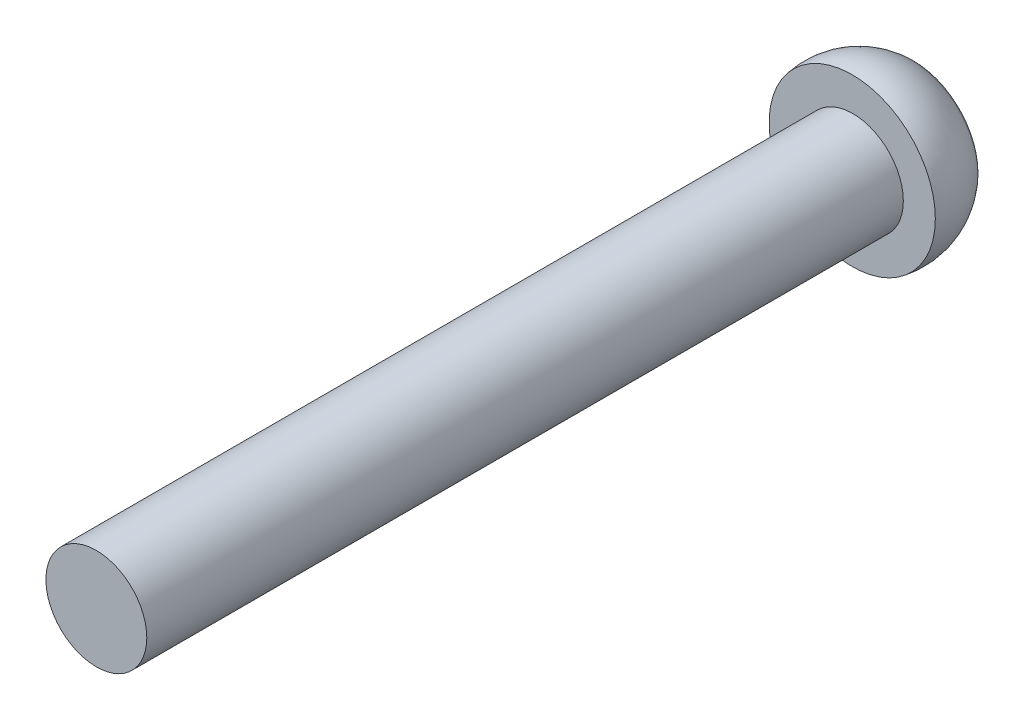
ISO-10303-21;
HEADER;
FILE_DESCRIPTION(('STEP AP214'),'2;1');
FILE_NAME('part.step','',(''),(''),'','','');
FILE_SCHEMA(('AUTOMOTIVE_DESIGN { 1 0 10303 214 1 1 1 1 }'));
ENDSEC;
DATA;
#1=APPLICATION_CONTEXT('core data for automotive mechanical design processes');
#2=APPLICATION_PROTOCOL_DEFINITION('international standard','automotive_design',2000,#1);
#3=PRODUCT_CONTEXT('',#1,'mechanical');
#4=PRODUCT('Part','Part','',(#3));
#5=PRODUCT_RELATED_PRODUCT_CATEGORY('part','',(#4));
#6=PRODUCT_DEFINITION_FORMATION('','',#4);
#7=PRODUCT_DEFINITION_CONTEXT('part definition',#1,'design');
#8=PRODUCT_DEFINITION('design','',#6,#7);
#9=PRODUCT_DEFINITION_SHAPE('','',#8);
#10=(LENGTH_UNIT() NAMED_UNIT(*) SI_UNIT(.MILLI.,.METRE.));
#11=(NAMED_UNIT(*) PLANE_ANGLE_UNIT() SI_UNIT($,.RADIAN.));
#12=(NAMED_UNIT(*) SI_UNIT($,.STERADIAN.) SOLID_ANGLE_UNIT());
#13=UNCERTAINTY_MEASURE_WITH_UNIT(LENGTH_MEASURE(1.E-05),#10,'distance_accuracy_value','');
#14=(GEOMETRIC_REPRESENTATION_CONTEXT(3) GLOBAL_UNCERTAINTY_ASSIGNED_CONTEXT((#13)) GLOBAL_UNIT_ASSIGNED_CONTEXT((#10,
#11,#12)) REPRESENTATION_CONTEXT('',''));
#15=CARTESIAN_POINT('',(0.,0.,0.));
#16=DIRECTION('',(0.,0.,1.));
#17=DIRECTION('',(1.,0.,0.));
#18=AXIS2_PLACEMENT_3D('',#15,#16,#17);
#19=CARTESIAN_POINT('',(0.,0.,0.));
#20=DIRECTION('',(0.,0.,1.));
#21=DIRECTION('',(1.,0.,0.));
#22=AXIS2_PLACEMENT_3D('',#19,#20,#21);
#23=PLANE('',#22);
#24=CARTESIAN_POINT('',(0.,0.,0.));
#25=DIRECTION('',(0.,0.,1.));
#26=DIRECTION('',(1.,0.,0.));
#27=AXIS2_PLACEMENT_3D('',#24,#25,#26);
#28=CIRCLE('',#27,1.64786324972712);
#29=CARTESIAN_POINT('',(1.64786324972712,0.,0.));
#30=VERTEX_POINT('',#29);
#31=EDGE_CURVE('E204',#30,#30,#28,.T.);
#32=ORIENTED_EDGE('',*,*,#31,.T.);
#33=EDGE_LOOP('',(#32));
#34=FACE_BOUND('',#33,.T.);
#35=CARTESIAN_POINT('',(0.0135896024399493,-0.0135896024399496,0.));
#36=DIRECTION('',(0.,0.,1.));
#37=DIRECTION('',(1.,0.,0.));
#38=AXIS2_PLACEMENT_3D('',#35,#36,#37);
#39=CIRCLE('',#38,1.);
#40=CARTESIAN_POINT('',(1.01358960243995,-0.0135896024399496,0.));
#41=VERTEX_POINT('',#40);
#42=EDGE_CURVE('E344',#41,#41,#39,.T.);
#43=ORIENTED_EDGE('',*,*,#42,.F.);
#44=EDGE_LOOP('',(#43));
#45=FACE_BOUND('',#44,.T.);
#46=ADVANCED_FACE('F35',(#34,#45),#23,.T.);
#47=CARTESIAN_POINT('',(0.,0.,-1.34074998965091));
#48=DIRECTION('',(0.,0.,-1.));
#49=DIRECTION('',(-1.,0.,0.));
#50=AXIS2_PLACEMENT_3D('',#47,#48,#49);
#51=PLANE('',#50);
#52=DIRECTION('',(0.,-1.,0.));
#53=VECTOR('',#52,1.);
#54=CARTESIAN_POINT('',(0.25,-0.25,-1.34074998965091));
#55=LINE('',#54,#53);
#56=CARTESIAN_POINT('',(0.25,-0.25,-1.34074998965091));
#57=VERTEX_POINT('',#56);
#58=CARTESIAN_POINT('',(0.25,-0.912522745887616,-1.34074998965091));
#59=VERTEX_POINT('',#58);
#60=EDGE_CURVE('E323',#57,#59,#55,.T.);
#61=ORIENTED_EDGE('',*,*,#60,.F.);
#62=DIRECTION('',(-1.,0.,0.));
#63=VECTOR('',#62,1.);
#64=CARTESIAN_POINT('',(1.,-0.25,-1.34074998965091));
#65=LINE('',#64,#63);
#66=CARTESIAN_POINT('',(0.912522745887616,-0.25,-1.34074998965091));
#67=VERTEX_POINT('',#66);
#68=EDGE_CURVE('E357',#67,#57,#65,.T.);
#69=ORIENTED_EDGE('',*,*,#68,.F.);
#70=CARTESIAN_POINT('',(0.,0.,-1.34074998965091));
#71=DIRECTION('',(0.,0.,1.));
#72=DIRECTION('',(1.,0.,0.));
#73=AXIS2_PLACEMENT_3D('',#70,#71,#72);
#74=CIRCLE('',#73,0.946148910987205);
#75=EDGE_CURVE('E210',#59,#67,#74,.T.);
#76=ORIENTED_EDGE('',*,*,#75,.F.);
#77=EDGE_LOOP('',(#61,#69,#76));
#78=FACE_BOUND('',#77,.T.);
#79=ADVANCED_FACE('F384',(#78),#51,.T.);
#80=DIRECTION('',(1.,0.,0.));
#81=VECTOR('',#80,1.);
#82=CARTESIAN_POINT('',(1.,0.25,-1.34074998965091));
#83=LINE('',#82,#81);
#84=CARTESIAN_POINT('',(0.25,0.25,-1.34074998965091));
#85=VERTEX_POINT('',#84);
#86=CARTESIAN_POINT('',(0.912522745887616,0.25,-1.34074998965091));
#87=VERTEX_POINT('',#86);
#88=EDGE_CURVE('E355',#85,#87,#83,.T.);
#89=ORIENTED_EDGE('',*,*,#88,.F.);
#90=DIRECTION('',(0.,-1.,0.));
#91=VECTOR('',#90,1.);
#92=CARTESIAN_POINT('',(0.25,1.,-1.34074998965091));
#93=LINE('',#92,#91);
#94=CARTESIAN_POINT('',(0.25,0.912522745887616,-1.34074998965091));
#95=VERTEX_POINT('',#94);
#96=EDGE_CURVE('E352',#95,#85,#93,.T.);
#97=ORIENTED_EDGE('',*,*,#96,.F.);
#98=EDGE_CURVE('E211',#87,#95,#74,.T.);
#99=ORIENTED_EDGE('',*,*,#98,.F.);
#100=EDGE_LOOP('',(#89,#97,#99));
#101=FACE_BOUND('',#100,.T.);
#102=ADVANCED_FACE('F405',(#101),#51,.T.);
#103=DIRECTION('',(0.,1.,0.));
#104=VECTOR('',#103,1.);
#105=CARTESIAN_POINT('',(-0.25,1.,-1.34074998965091));
#106=LINE('',#105,#104);
#107=CARTESIAN_POINT('',(-0.25,0.25,-1.34074998965091));
#108=VERTEX_POINT('',#107);
#109=CARTESIAN_POINT('',(-0.25,0.912522745887616,-1.34074998965091));
#110=VERTEX_POINT('',#109);
#111=EDGE_CURVE('E350',#108,#110,#106,.T.);
#112=ORIENTED_EDGE('',*,*,#111,.F.);
#113=DIRECTION('',(1.,0.,0.));
#114=VECTOR('',#113,1.);
#115=CARTESIAN_POINT('',(-0.25,0.25,-1.34074998965091));
#116=LINE('',#115,#114);
#117=CARTESIAN_POINT('',(-0.912522745887616,0.25,-1.34074998965091));
#118=VERTEX_POINT('',#117);
#119=EDGE_CURVE('E341',#118,#108,#116,.T.);
#120=ORIENTED_EDGE('',*,*,#119,.F.);
#121=EDGE_CURVE('E214',#110,#118,#74,.T.);
#122=ORIENTED_EDGE('',*,*,#121,.F.);
#123=EDGE_LOOP('',(#112,#120,#122));
#124=FACE_BOUND('',#123,.T.);
#125=ADVANCED_FACE('F393',(#124),#51,.T.);
#126=DIRECTION('',(0.,1.,0.));
#127=VECTOR('',#126,1.);
#128=CARTESIAN_POINT('',(-0.25,-0.25,-1.34074998965091));
#129=LINE('',#128,#127);
#130=CARTESIAN_POINT('',(-0.25,-0.912522745887616,-1.34074998965091));
#131=VERTEX_POINT('',#130);
#132=CARTESIAN_POINT('',(-0.25,-0.25,-1.34074998965091));
#133=VERTEX_POINT('',#132);
#134=EDGE_CURVE('E336',#131,#133,#129,.T.);
#135=ORIENTED_EDGE('',*,*,#134,.F.);
#136=CARTESIAN_POINT('',(-0.912522745887616,-0.25,-1.34074998965091));
#137=VERTEX_POINT('',#136);
#138=EDGE_CURVE('E332',#137,#131,#74,.T.);
#139=ORIENTED_EDGE('',*,*,#138,.F.);
#140=DIRECTION('',(-1.,0.,0.));
#141=VECTOR('',#140,1.);
#142=CARTESIAN_POINT('',(-0.25,-0.25,-1.34074998965091));
#143=LINE('',#142,#141);
#144=EDGE_CURVE('E54',#133,#137,#143,.T.);
#145=ORIENTED_EDGE('',*,*,#144,.F.);
#146=EDGE_LOOP('',(#135,#139,#145));
#147=FACE_BOUND('',#146,.T.);
#148=ADVANCED_FACE('F338',(#147),#51,.T.);
#149=CARTESIAN_POINT('',(0.,0.,-0.840749989650906));
#150=DIRECTION('',(0.,0.,1.));
#151=DIRECTION('',(1.,0.,0.));
#152=AXIS2_PLACEMENT_3D('',#149,#150,#151);
#153=TOROIDAL_SURFACE('',#152,0.946148910987205,0.5);
#154=CARTESIAN_POINT('',(-0.248731418139729,-1.00019999999798,-1.33355550441005));
#155=CARTESIAN_POINT('',(-0.24958614674247,-0.970985632246849,-1.33840291119549));
#156=CARTESIAN_POINT('',(-0.250008527124177,-0.941356796484875,-1.34079834937522));
#157=CARTESIAN_POINT('',(-0.249991262751628,-0.882089876302517,-1.34070043825306));
#158=CARTESIAN_POINT('',(-0.249551119047547,-0.85245179645112,-1.33820425926608));
#159=CARTESIAN_POINT('',(-0.247809665705305,-0.793993999996859,-1.32832798658651));
#160=CARTESIAN_POINT('',(-0.246507536336563,-0.765175089641474,-1.32094324397078));
#161=CARTESIAN_POINT('',(-0.243070557403056,-0.709267037425154,-1.30145116783077));
#162=CARTESIAN_POINT('',(-0.240936699840295,-0.682175879498399,-1.28934946022943));
#163=CARTESIAN_POINT('',(-0.235964122234399,-0.63141444611803,-1.26114857125648));
#164=CARTESIAN_POINT('',(-0.233151434951457,-0.607659926555948,-1.24519702900446));
#165=CARTESIAN_POINT('',(-0.226841694587375,-0.563251924748829,-1.20941271319113));
#166=CARTESIAN_POINT('',(-0.223342242870993,-0.542609773111442,-1.18956633629338));
#167=CARTESIAN_POINT('',(-0.219536364668565,-0.523969633910927,-1.16798212843628));
#168=B_SPLINE_CURVE_WITH_KNOTS('',3,(#154,#155,#156,#157,#158,#159,#160,#161,#162,#163,#164,
#165,#166,#167),.UNSPECIFIED.,.F.,.F.,(4,2,2,2,2,2,4),(0.,0.0887691650607502,0.177589696147095,
0.266494815301146,0.355294220222159,0.441116211611775,0.527243463159091),.UNSPECIFIED.);
#169=CARTESIAN_POINT('',(-0.248772653500362,-0.998772653500362,-1.33378936176114));
#170=VERTEX_POINT('',#169);
#171=EDGE_CURVE('E11',#170,#131,#168,.T.);
#172=ORIENTED_EDGE('',*,*,#171,.F.);
#173=CARTESIAN_POINT('',(0.2502,-0.998762636472414,-1.33373255237265));
#174=CARTESIAN_POINT('',(0.22935821029771,-0.998909155419599,-1.33456350261405));
#175=CARTESIAN_POINT('',(0.208510714237745,-0.99902632673639,-1.33522801417274));
#176=CARTESIAN_POINT('',(0.166810073600685,-0.999214972415781,-1.33629787698463));
#177=CARTESIAN_POINT('',(0.145956929482305,-0.999286449767193,-1.3367032451882));
#178=CARTESIAN_POINT('',(0.0834051338906349,-0.999451826949895,-1.33764114579784));
#179=CARTESIAN_POINT('',(0.0417025669453174,-0.999496738672754,-1.33789585283518));
#180=CARTESIAN_POINT('',(-0.0417025669453178,-0.999496738672754,-1.33789585283518));
#181=CARTESIAN_POINT('',(-0.0834051338906354,-0.999451826949895,-1.33764114579784));
#182=CARTESIAN_POINT('',(-0.145956929482306,-0.999286449767193,-1.3367032451882));
#183=CARTESIAN_POINT('',(-0.166810073600686,-0.999214972415781,-1.33629787698463));
#184=CARTESIAN_POINT('',(-0.208510714237745,-0.99902632673639,-1.33522801417274));
#185=CARTESIAN_POINT('',(-0.22935821029771,-0.998909155419599,-1.33456350261405));
#186=CARTESIAN_POINT('',(-0.2502,-0.998762636472414,-1.33373255237265));
#187=B_SPLINE_CURVE_WITH_KNOTS('',3,(#173,#174,#175,#176,#177,#178,#179,#180,#181,#182,#183,
#184,#185,#186),.UNSPECIFIED.,.F.,.F.,(4,2,2,2,2,2,4),(0.,0.0625742628865592,0.125144432413641,
0.250250102299897,0.375355772186154,0.437925941713235,0.500500204599794),.UNSPECIFIED.);
#188=CARTESIAN_POINT('',(0.248772653499892,-0.998772653499892,-1.33378936175847));
#189=VERTEX_POINT('',#188);
#190=EDGE_CURVE('E47',#189,#170,#187,.T.);
#191=ORIENTED_EDGE('',*,*,#190,.F.);
#192=CARTESIAN_POINT('',(0.219536364668565,-0.523969633910927,-1.16798212843628));
#193=CARTESIAN_POINT('',(0.223417162959779,-0.542973823364192,-1.18999122923084));
#194=CARTESIAN_POINT('',(0.22697935323117,-0.564063715021397,-1.210193414155));
#195=CARTESIAN_POINT('',(0.23338358711039,-0.609458557906342,-1.2465136293228));
#196=CARTESIAN_POINT('',(0.236228669439464,-0.633749255233126,-1.262648893011));
#197=CARTESIAN_POINT('',(0.241004749968007,-0.683258284015449,-1.28973539168155));
#198=CARTESIAN_POINT('',(0.24297988223307,-0.708336626868522,-1.30093692338774));
#199=CARTESIAN_POINT('',(0.246219254039212,-0.76000121173847,-1.3193083138189));
#200=CARTESIAN_POINT('',(0.247482662017373,-0.78658917782316,-1.3264734565162));
#201=CARTESIAN_POINT('',(0.249394296316473,-0.844287328167994,-1.33731487336245));
#202=CARTESIAN_POINT('',(0.249934375709412,-0.875517583212375,-1.34037781580477));
#203=CARTESIAN_POINT('',(0.250054829507455,-0.938055105897448,-1.34106094323972));
#204=CARTESIAN_POINT('',(0.249634703786009,-0.969362405183311,-1.33867829187373));
#205=CARTESIAN_POINT('',(0.248731418139729,-1.00019999999798,-1.33355550441005));
#206=B_SPLINE_CURVE_WITH_KNOTS('',3,(#192,#193,#194,#195,#196,#197,#198,#199,#200,#201,#202,
#203,#204,#205),.UNSPECIFIED.,.F.,.F.,(4,2,2,2,2,2,4),(0.,0.0878170982428003,0.175255569681402,
0.257519005261126,0.339878357327818,0.43353414273552,0.527238720237572),.UNSPECIFIED.);
#207=EDGE_CURVE('E298',#59,#189,#206,.T.);
#208=ORIENTED_EDGE('',*,*,#207,.F.);
#209=ORIENTED_EDGE('',*,*,#75,.T.);
#210=CARTESIAN_POINT('',(1.00019999999798,-0.248731418139729,-1.33355550441005));
#211=CARTESIAN_POINT('',(0.970985632246848,-0.24958614674247,-1.33840291119549));
#212=CARTESIAN_POINT('',(0.941356796484875,-0.250008527124176,-1.34079834937522));
#213=CARTESIAN_POINT('',(0.882089876302517,-0.249991262751628,-1.34070043825306));
#214=CARTESIAN_POINT('',(0.85245179645112,-0.249551119047546,-1.33820425926608));
#215=CARTESIAN_POINT('',(0.793993999996859,-0.247809665705305,-1.32832798658651));
#216=CARTESIAN_POINT('',(0.765175089641474,-0.246507536336563,-1.32094324397078));
#217=CARTESIAN_POINT('',(0.709267037425154,-0.243070557403056,-1.30145116783077));
#218=CARTESIAN_POINT('',(0.682175879498399,-0.240936699840295,-1.28934946022943));
#219=CARTESIAN_POINT('',(0.631414446117999,-0.235964122234396,-1.26114857125646));
#220=CARTESIAN_POINT('',(0.60765992655589,-0.23315143495145,-1.24519702900442));
#221=CARTESIAN_POINT('',(0.563251924748724,-0.226841694587359,-1.20941271319104));
#222=CARTESIAN_POINT('',(0.542609773111318,-0.223342242870971,-1.18956633629326));
#223=CARTESIAN_POINT('',(0.52396963391079,-0.219536364668537,-1.16798212843612));
#224=B_SPLINE_CURVE_WITH_KNOTS('',3,(#210,#211,#212,#213,#214,#215,#216,#217,#218,#219,#220,
#221,#222,#223),.UNSPECIFIED.,.F.,.F.,(4,2,2,2,2,2,4),(0.,0.0887691650607503,0.177589696147095,
0.266494815301146,0.355294220222159,0.441116211611879,0.527243463159302),.UNSPECIFIED.);
#225=CARTESIAN_POINT('',(0.998772653500362,-0.248772653500362,-1.33378936176114));
#226=VERTEX_POINT('',#225);
#227=EDGE_CURVE('E293',#226,#67,#224,.T.);
#228=ORIENTED_EDGE('',*,*,#227,.F.);
#229=CARTESIAN_POINT('',(0.998762636472414,0.2502,-1.33373255237265));
#230=CARTESIAN_POINT('',(0.998909155419599,0.22935821029771,-1.33456350261405));
#231=CARTESIAN_POINT('',(0.99902632673639,0.208510714237745,-1.33522801417274));
#232=CARTESIAN_POINT('',(0.999214972415781,0.166810073600685,-1.33629787698463));
#233=CARTESIAN_POINT('',(0.999286449767193,0.145956929482306,-1.3367032451882));
#234=CARTESIAN_POINT('',(0.999451826949894,0.0834051338906351,-1.33764114579784));
#235=CARTESIAN_POINT('',(0.999496738672753,0.0417025669453175,-1.33789585283518));
#236=CARTESIAN_POINT('',(0.999496738672753,-0.0417025669453176,-1.33789585283518));
#237=CARTESIAN_POINT('',(0.999451826949894,-0.0834051338906352,-1.33764114579784));
#238=CARTESIAN_POINT('',(0.999286449767193,-0.145956929482306,-1.3367032451882));
#239=CARTESIAN_POINT('',(0.999214972415781,-0.166810073600686,-1.33629787698463));
#240=CARTESIAN_POINT('',(0.99902632673639,-0.208510714237745,-1.33522801417274));
#241=CARTESIAN_POINT('',(0.998909155419599,-0.22935821029771,-1.33456350261405));
#242=CARTESIAN_POINT('',(0.998762636472414,-0.2502,-1.33373255237265));
#243=B_SPLINE_CURVE_WITH_KNOTS('',3,(#229,#230,#231,#232,#233,#234,#235,#236,#237,#238,#239,
#240,#241,#242),.UNSPECIFIED.,.F.,.F.,(4,2,2,2,2,2,4),(0.,0.0625742628865592,0.125144432413641,
0.250250102299897,0.375355772186154,0.437925941713235,0.500500204599794),.UNSPECIFIED.);
#244=CARTESIAN_POINT('',(0.998772653499892,0.248772653499892,-1.33378936175847));
#245=VERTEX_POINT('',#244);
#246=EDGE_CURVE('E288',#245,#226,#243,.T.);
#247=ORIENTED_EDGE('',*,*,#246,.F.);
#248=CARTESIAN_POINT('',(0.52396963391079,0.219536364668537,-1.16798212843612));
#249=CARTESIAN_POINT('',(0.542973823364044,0.223417162959752,-1.18999122923069));
#250=CARTESIAN_POINT('',(0.564063715021239,0.226979353231145,-1.21019341415486));
#251=CARTESIAN_POINT('',(0.609458557906166,0.233383587110368,-1.24651362932268));
#252=CARTESIAN_POINT('',(0.633749255232941,0.236228669439444,-1.26264889301088));
#253=CARTESIAN_POINT('',(0.683258284015249,0.24100474996799,-1.28973539168145));
#254=CARTESIAN_POINT('',(0.708336626868314,0.242979882233055,-1.30093692338765));
#255=CARTESIAN_POINT('',(0.76000121173825,0.246219254039201,-1.31930831381883));
#256=CARTESIAN_POINT('',(0.786589177822934,0.247482662017364,-1.32647345651615));
#257=CARTESIAN_POINT('',(0.844287328167799,0.249394296316469,-1.33731487336242));
#258=CARTESIAN_POINT('',(0.875517583212219,0.249934375709411,-1.34037781580476));
#259=CARTESIAN_POINT('',(0.93805510589737,0.250054829507456,-1.34106094323972));
#260=CARTESIAN_POINT('',(0.969362405183272,0.24963470378601,-1.33867829187373));
#261=CARTESIAN_POINT('',(1.00019999999798,0.248731418139729,-1.33355550441005));
#262=B_SPLINE_CURVE_WITH_KNOTS('',3,(#248,#249,#250,#251,#252,#253,#254,#255,#256,#257,#258,
#259,#260,#261),.UNSPECIFIED.,.F.,.F.,(4,2,2,2,2,2,4),(0.,0.0878170982427962,0.175255569681394,
0.25751900526111,0.339878357327794,0.433534142735613,0.527238720237782),.UNSPECIFIED.);
#263=EDGE_CURVE('E283',#87,#245,#262,.T.);
#264=ORIENTED_EDGE('',*,*,#263,.F.);
#265=ORIENTED_EDGE('',*,*,#98,.T.);
#266=CARTESIAN_POINT('',(0.248731418139729,1.00019999999798,-1.33355550441005));
#267=CARTESIAN_POINT('',(0.24958614674247,0.970985632246848,-1.33840291119549));
#268=CARTESIAN_POINT('',(0.250008527124176,0.941356796484875,-1.34079834937522));
#269=CARTESIAN_POINT('',(0.249991262751628,0.882089876302516,-1.34070043825306));
#270=CARTESIAN_POINT('',(0.249551119047547,0.85245179645112,-1.33820425926608));
#271=CARTESIAN_POINT('',(0.247809665705305,0.793993999996859,-1.32832798658651));
#272=CARTESIAN_POINT('',(0.246507536336563,0.765175089641474,-1.32094324397078));
#273=CARTESIAN_POINT('',(0.243070557403056,0.709267037425154,-1.30145116783077));
#274=CARTESIAN_POINT('',(0.240936699840295,0.682175879498399,-1.28934946022943));
#275=CARTESIAN_POINT('',(0.235964122234396,0.631414446117999,-1.26114857125646));
#276=CARTESIAN_POINT('',(0.23315143495145,0.60765992655589,-1.24519702900442));
#277=CARTESIAN_POINT('',(0.226841694587359,0.563251924748724,-1.20941271319104));
#278=CARTESIAN_POINT('',(0.223342242870971,0.542609773111318,-1.18956633629326));
#279=CARTESIAN_POINT('',(0.219536364668537,0.523969633910789,-1.16798212843612));
#280=B_SPLINE_CURVE_WITH_KNOTS('',3,(#266,#267,#268,#269,#270,#271,#272,#273,#274,#275,#276,
#277,#278,#279),.UNSPECIFIED.,.F.,.F.,(4,2,2,2,2,2,4),(0.,0.0887691650607504,0.177589696147095,
0.266494815301146,0.355294220222159,0.441116211611879,0.527243463159301),.UNSPECIFIED.);
#281=CARTESIAN_POINT('',(0.248772653500362,0.998772653500362,-1.33378936176114));
#282=VERTEX_POINT('',#281);
#283=EDGE_CURVE('E260',#282,#95,#280,.T.);
#284=ORIENTED_EDGE('',*,*,#283,.F.);
#285=CARTESIAN_POINT('',(-0.2502,0.998762636472413,-1.33373255237265));
#286=CARTESIAN_POINT('',(-0.22935821029771,0.998909155419599,-1.33456350261405));
#287=CARTESIAN_POINT('',(-0.208510714237745,0.999026326736389,-1.33522801417274));
#288=CARTESIAN_POINT('',(-0.166810073600685,0.999214972415781,-1.33629787698463));
#289=CARTESIAN_POINT('',(-0.145956929482306,0.999286449767193,-1.3367032451882));
#290=CARTESIAN_POINT('',(-0.0834051338906351,0.999451826949894,-1.33764114579784));
#291=CARTESIAN_POINT('',(-0.0417025669453175,0.999496738672753,-1.33789585283518));
#292=CARTESIAN_POINT('',(0.0417025669453176,0.999496738672753,-1.33789585283518));
#293=CARTESIAN_POINT('',(0.0834051338906352,0.999451826949894,-1.33764114579784));
#294=CARTESIAN_POINT('',(0.145956929482306,0.999286449767193,-1.3367032451882));
#295=CARTESIAN_POINT('',(0.166810073600686,0.999214972415781,-1.33629787698463));
#296=CARTESIAN_POINT('',(0.208510714237745,0.999026326736389,-1.33522801417274));
#297=CARTESIAN_POINT('',(0.22935821029771,0.998909155419599,-1.33456350261405));
#298=CARTESIAN_POINT('',(0.2502,0.998762636472413,-1.33373255237265));
#299=B_SPLINE_CURVE_WITH_KNOTS('',3,(#285,#286,#287,#288,#289,#290,#291,#292,#293,#294,#295,
#296,#297,#298),.UNSPECIFIED.,.F.,.F.,(4,2,2,2,2,2,4),(0.,0.0625742628865592,0.125144432413641,
0.250250102299897,0.375355772186154,0.437925941713235,0.500500204599794),.UNSPECIFIED.);
#300=CARTESIAN_POINT('',(-0.248772653499892,0.998772653499892,-1.33378936175847));
#301=VERTEX_POINT('',#300);
#302=EDGE_CURVE('E255',#301,#282,#299,.T.);
#303=ORIENTED_EDGE('',*,*,#302,.F.);
#304=CARTESIAN_POINT('',(-0.219536364668537,0.52396963391079,-1.16798212843612));
#305=CARTESIAN_POINT('',(-0.223417162959752,0.542973823364044,-1.18999122923069));
#306=CARTESIAN_POINT('',(-0.226979353231145,0.564063715021239,-1.21019341415486));
#307=CARTESIAN_POINT('',(-0.233383587110368,0.609458557906166,-1.24651362932268));
#308=CARTESIAN_POINT('',(-0.236228669439444,0.633749255232941,-1.26264889301088));
#309=CARTESIAN_POINT('',(-0.24100474996799,0.683258284015249,-1.28973539168145));
#310=CARTESIAN_POINT('',(-0.242979882233055,0.708336626868314,-1.30093692338765));
#311=CARTESIAN_POINT('',(-0.246219254039201,0.76000121173825,-1.31930831381883));
#312=CARTESIAN_POINT('',(-0.247482662017364,0.786589177822934,-1.32647345651615));
#313=CARTESIAN_POINT('',(-0.249394296316469,0.844287328167799,-1.33731487336242));
#314=CARTESIAN_POINT('',(-0.249934375709411,0.875517583212218,-1.34037781580476));
#315=CARTESIAN_POINT('',(-0.250054829507456,0.938055105897369,-1.34106094323972));
#316=CARTESIAN_POINT('',(-0.24963470378601,0.969362405183272,-1.33867829187373));
#317=CARTESIAN_POINT('',(-0.248731418139729,1.00019999999798,-1.33355550441005));
#318=B_SPLINE_CURVE_WITH_KNOTS('',3,(#304,#305,#306,#307,#308,#309,#310,#311,#312,#313,#314,
#315,#316,#317),.UNSPECIFIED.,.F.,.F.,(4,2,2,2,2,2,4),(0.,0.0878170982427962,0.175255569681394,
0.25751900526111,0.339878357327794,0.433534142735613,0.527238720237782),.UNSPECIFIED.);
#319=EDGE_CURVE('E250',#110,#301,#318,.T.);
#320=ORIENTED_EDGE('',*,*,#319,.F.);
#321=ORIENTED_EDGE('',*,*,#121,.T.);
#322=CARTESIAN_POINT('',(-1.00019999999798,0.248731418139729,-1.33355550441005));
#323=CARTESIAN_POINT('',(-0.970985632246848,0.24958614674247,-1.33840291119549));
#324=CARTESIAN_POINT('',(-0.941356796484875,0.250008527124176,-1.34079834937522));
#325=CARTESIAN_POINT('',(-0.882089876302517,0.249991262751628,-1.34070043825306));
#326=CARTESIAN_POINT('',(-0.85245179645112,0.249551119047546,-1.33820425926608));
#327=CARTESIAN_POINT('',(-0.793993999996859,0.247809665705305,-1.32832798658651));
#328=CARTESIAN_POINT('',(-0.765175089641474,0.246507536336563,-1.32094324397078));
#329=CARTESIAN_POINT('',(-0.709267037425154,0.243070557403056,-1.30145116783077));
#330=CARTESIAN_POINT('',(-0.682175879498399,0.240936699840295,-1.28934946022943));
#331=CARTESIAN_POINT('',(-0.63141444611803,0.235964122234399,-1.26114857125648));
#332=CARTESIAN_POINT('',(-0.607659926555948,0.233151434951457,-1.24519702900446));
#333=CARTESIAN_POINT('',(-0.563251924748829,0.226841694587375,-1.20941271319113));
#334=CARTESIAN_POINT('',(-0.542609773111442,0.223342242870993,-1.18956633629338));
#335=CARTESIAN_POINT('',(-0.523969633910927,0.219536364668565,-1.16798212843628));
#336=B_SPLINE_CURVE_WITH_KNOTS('',3,(#322,#323,#324,#325,#326,#327,#328,#329,#330,#331,#332,
#333,#334,#335),.UNSPECIFIED.,.F.,.F.,(4,2,2,2,2,2,4),(0.,0.0887691650607503,0.177589696147095,
0.266494815301146,0.355294220222159,0.441116211611775,0.527243463159091),.UNSPECIFIED.);
#337=CARTESIAN_POINT('',(-0.998772653500362,0.248772653500362,-1.33378936176114));
#338=VERTEX_POINT('',#337);
#339=EDGE_CURVE('E245',#338,#118,#336,.T.);
#340=ORIENTED_EDGE('',*,*,#339,.F.);
#341=CARTESIAN_POINT('',(-0.998762636472414,-0.2502,-1.33373255237265));
#342=CARTESIAN_POINT('',(-0.998909155419599,-0.22935821029771,-1.33456350261405));
#343=CARTESIAN_POINT('',(-0.99902632673639,-0.208510714237745,-1.33522801417274));
#344=CARTESIAN_POINT('',(-0.999214972415781,-0.166810073600686,-1.33629787698463));
#345=CARTESIAN_POINT('',(-0.999286449767193,-0.145956929482306,-1.3367032451882));
#346=CARTESIAN_POINT('',(-0.999451826949894,-0.0834051338906352,-1.33764114579784));
#347=CARTESIAN_POINT('',(-0.999496738672753,-0.0417025669453176,-1.33789585283518));
#348=CARTESIAN_POINT('',(-0.999496738672753,0.0417025669453176,-1.33789585283518));
#349=CARTESIAN_POINT('',(-0.999451826949894,0.0834051338906352,-1.33764114579784));
#350=CARTESIAN_POINT('',(-0.999286449767193,0.145956929482306,-1.3367032451882));
#351=CARTESIAN_POINT('',(-0.999214972415781,0.166810073600686,-1.33629787698463));
#352=CARTESIAN_POINT('',(-0.99902632673639,0.208510714237745,-1.33522801417274));
#353=CARTESIAN_POINT('',(-0.998909155419599,0.22935821029771,-1.33456350261405));
#354=CARTESIAN_POINT('',(-0.998762636472414,0.2502,-1.33373255237265));
#355=B_SPLINE_CURVE_WITH_KNOTS('',3,(#341,#342,#343,#344,#345,#346,#347,#348,#349,#350,#351,
#352,#353,#354),.UNSPECIFIED.,.F.,.F.,(4,2,2,2,2,2,4),(0.,0.0625742628865592,0.125144432413641,
0.250250102299897,0.375355772186154,0.437925941713235,0.500500204599794),.UNSPECIFIED.);
#356=CARTESIAN_POINT('',(-0.998772653499892,-0.248772653499892,-1.33378936175847));
#357=VERTEX_POINT('',#356);
#358=EDGE_CURVE('E220',#357,#338,#355,.T.);
#359=ORIENTED_EDGE('',*,*,#358,.F.);
#360=CARTESIAN_POINT('',(-0.523969633910927,-0.219536364668565,-1.16798212843628));
#361=CARTESIAN_POINT('',(-0.542973823364192,-0.223417162959779,-1.18999122923084));
#362=CARTESIAN_POINT('',(-0.564063715021396,-0.226979353231171,-1.210193414155));
#363=CARTESIAN_POINT('',(-0.609458557906342,-0.23338358711039,-1.2465136293228));
#364=CARTESIAN_POINT('',(-0.633749255233126,-0.236228669439465,-1.262648893011));
#365=CARTESIAN_POINT('',(-0.683258284015449,-0.241004749968007,-1.28973539168155));
#366=CARTESIAN_POINT('',(-0.708336626868522,-0.24297988223307,-1.30093692338774));
#367=CARTESIAN_POINT('',(-0.76000121173847,-0.246219254039213,-1.3193083138189));
#368=CARTESIAN_POINT('',(-0.78658917782316,-0.247482662017374,-1.3264734565162));
#369=CARTESIAN_POINT('',(-0.844287328167994,-0.249394296316473,-1.33731487336245));
#370=CARTESIAN_POINT('',(-0.875517583212375,-0.249934375709413,-1.34037781580477));
#371=CARTESIAN_POINT('',(-0.938055105897448,-0.250054829507455,-1.34106094323972));
#372=CARTESIAN_POINT('',(-0.96936240518331,-0.249634703786009,-1.33867829187373));
#373=CARTESIAN_POINT('',(-1.00019999999798,-0.248731418139729,-1.33355550441005));
#374=B_SPLINE_CURVE_WITH_KNOTS('',3,(#360,#361,#362,#363,#364,#365,#366,#367,#368,#369,#370,
#371,#372,#373),.UNSPECIFIED.,.F.,.F.,(4,2,2,2,2,2,4),(0.,0.0878170982428004,0.175255569681402,
0.257519005261125,0.339878357327818,0.43353414273552,0.527238720237571),.UNSPECIFIED.);
#375=EDGE_CURVE('E165',#137,#357,#374,.T.);
#376=ORIENTED_EDGE('',*,*,#375,.F.);
#377=ORIENTED_EDGE('',*,*,#138,.T.);
#378=EDGE_LOOP('',(#172,#191,#208,#209,#228,#247,#264,#265,#284,#303,#320,#321,#340,#359,#376,#377));
#379=FACE_BOUND('',#378,.T.);
#380=CARTESIAN_POINT('',(0.,0.,-1.16818212843628));
#381=DIRECTION('',(0.,0.,1.));
#382=DIRECTION('',(1.,0.,0.));
#383=AXIS2_PLACEMENT_3D('',#380,#381,#382);
#384=CIRCLE('',#383,1.32402216287259);
#385=CARTESIAN_POINT('',(1.32402216287259,0.,-1.16818212843628));
#386=VERTEX_POINT('',#385);
#387=EDGE_CURVE('E207',#386,#386,#384,.T.);
#388=ORIENTED_EDGE('',*,*,#387,.F.);
#389=EDGE_LOOP('',(#388));
#390=FACE_BOUND('',#389,.T.);
#391=ADVANCED_FACE('F226',(#379,#390),#153,.T.);
#392=CARTESIAN_POINT('',(0.,0.,-0.243317919784356));
#393=DIRECTION('',(0.,0.,1.));
#394=DIRECTION('',(1.,0.,0.));
#395=AXIS2_PLACEMENT_3D('',#392,#393,#394);
#396=DEGENERATE_TOROIDAL_SURFACE('',#395,0.256682080215679,1.41229906765225,.T.);
#397=ORIENTED_EDGE('',*,*,#387,.T.);
#398=EDGE_LOOP('',(#397));
#399=FACE_BOUND('',#398,.T.);
#400=ORIENTED_EDGE('',*,*,#31,.F.);
#401=EDGE_LOOP('',(#400));
#402=FACE_BOUND('',#401,.T.);
#403=ADVANCED_FACE('F315',(#399,#402),#396,.T.);
#404=CARTESIAN_POINT('',(-0.25,-0.25,-1.34074998965091));
#405=DIRECTION('',(-0.984807753012208,0.,0.173648177666931));
#406=DIRECTION('',(0.173648177666931,0.,0.984807753012208));
#407=AXIS2_PLACEMENT_3D('',#404,#405,#406);
#408=PLANE('',#407);
#409=DIRECTION('',(0.,-1.,0.));
#410=VECTOR('',#409,1.);
#411=CARTESIAN_POINT('',(-0.0135896024399495,0.,0.));
#412=LINE('',#411,#410);
#413=CARTESIAN_POINT('',(-0.0135896024399495,-0.0135896024399496,0.));
#414=VERTEX_POINT('',#413);
#415=CARTESIAN_POINT('',(-0.0135896024399495,-0.76358960243995,0.));
#416=VERTEX_POINT('',#415);
#417=EDGE_CURVE('E158',#414,#416,#412,.T.);
#418=ORIENTED_EDGE('',*,*,#417,.T.);
#419=DIRECTION('',(-0.171087869746036,-0.171087869746036,-0.970287525247814));
#420=VECTOR('',#419,1.);
#421=CARTESIAN_POINT('',(-0.235364470412882,-0.985364470412882,-1.25774777678301));
#422=LINE('',#421,#420);
#423=EDGE_CURVE('E160',#416,#170,#422,.T.);
#424=ORIENTED_EDGE('',*,*,#423,.T.);
#425=ORIENTED_EDGE('',*,*,#171,.T.);
#426=ORIENTED_EDGE('',*,*,#134,.T.);
#427=DIRECTION('',(-0.171087869746036,-0.171087869746036,-0.970287525247814));
#428=VECTOR('',#427,1.);
#429=CARTESIAN_POINT('',(-0.25,-0.25,-1.34074998965091));
#430=LINE('',#429,#428);
#431=EDGE_CURVE('E169',#414,#133,#430,.T.);
#432=ORIENTED_EDGE('',*,*,#431,.F.);
#433=EDGE_LOOP('',(#418,#424,#425,#426,#432));
#434=FACE_BOUND('',#433,.T.);
#435=ADVANCED_FACE('F231',(#434),#408,.F.);
#436=CARTESIAN_POINT('',(0.25,-1.,-1.34074998965091));
#437=DIRECTION('',(0.,-0.984807753012208,0.173648177666931));
#438=DIRECTION('',(0.,-0.173648177666931,-0.984807753012208));
#439=AXIS2_PLACEMENT_3D('',#436,#437,#438);
#440=PLANE('',#439);
#441=DIRECTION('',(1.,0.,0.));
#442=VECTOR('',#441,1.);
#443=CARTESIAN_POINT('',(0.,-0.76358960243995,0.));
#444=LINE('',#443,#442);
#445=CARTESIAN_POINT('',(0.0135896024399494,-0.76358960243995,0.));
#446=VERTEX_POINT('',#445);
#447=EDGE_CURVE('E200',#416,#446,#444,.T.);
#448=ORIENTED_EDGE('',*,*,#447,.T.);
#449=DIRECTION('',(0.171087869746036,-0.171087869746036,-0.970287525247814));
#450=VECTOR('',#449,1.);
#451=CARTESIAN_POINT('',(0.228046705619322,-0.978046705619323,-1.21624667034905));
#452=LINE('',#451,#450);
#453=EDGE_CURVE('E321',#446,#189,#452,.T.);
#454=ORIENTED_EDGE('',*,*,#453,.T.);
#455=ORIENTED_EDGE('',*,*,#190,.T.);
#456=ORIENTED_EDGE('',*,*,#423,.F.);
#457=EDGE_LOOP('',(#448,#454,#455,#456));
#458=FACE_BOUND('',#457,.T.);
#459=ADVANCED_FACE('F311',(#458),#440,.F.);
#460=CARTESIAN_POINT('',(0.25,-0.25,-1.34074998965091));
#461=DIRECTION('',(0.984807753012208,0.,0.173648177666931));
#462=DIRECTION('',(0.173648177666931,0.,-0.984807753012208));
#463=AXIS2_PLACEMENT_3D('',#460,#461,#462);
#464=PLANE('',#463);
#465=DIRECTION('',(0.,1.,0.));
#466=VECTOR('',#465,1.);
#467=CARTESIAN_POINT('',(0.0135896024399493,0.,0.));
#468=LINE('',#467,#466);
#469=CARTESIAN_POINT('',(0.0135896024399493,-0.0135896024399496,0.));
#470=VERTEX_POINT('',#469);
#471=EDGE_CURVE('E197',#446,#470,#468,.T.);
#472=ORIENTED_EDGE('',*,*,#471,.T.);
#473=DIRECTION('',(0.171087869746036,-0.171087869746036,-0.970287525247814));
#474=VECTOR('',#473,1.);
#475=CARTESIAN_POINT('',(0.25,-0.25,-1.34074998965091));
#476=LINE('',#475,#474);
#477=EDGE_CURVE('E327',#470,#57,#476,.T.);
#478=ORIENTED_EDGE('',*,*,#477,.T.);
#479=ORIENTED_EDGE('',*,*,#60,.T.);
#480=ORIENTED_EDGE('',*,*,#207,.T.);
#481=ORIENTED_EDGE('',*,*,#453,.F.);
#482=EDGE_LOOP('',(#472,#478,#479,#480,#481));
#483=FACE_BOUND('',#482,.T.);
#484=ADVANCED_FACE('F306',(#483),#464,.F.);
#485=CARTESIAN_POINT('',(1.,-0.25,-1.34074998965091));
#486=DIRECTION('',(0.,-0.984807753012208,0.173648177666931));
#487=DIRECTION('',(0.,-0.173648177666931,-0.984807753012208));
#488=AXIS2_PLACEMENT_3D('',#485,#486,#487);
#489=PLANE('',#488);
#490=DIRECTION('',(1.,0.,0.));
#491=VECTOR('',#490,1.);
#492=CARTESIAN_POINT('',(0.,-0.0135896024399496,0.));
#493=LINE('',#492,#491);
#494=CARTESIAN_POINT('',(0.76358960243995,-0.0135896024399496,0.));
#495=VERTEX_POINT('',#494);
#496=EDGE_CURVE('E194',#470,#495,#493,.T.);
#497=ORIENTED_EDGE('',*,*,#496,.T.);
#498=DIRECTION('',(0.171087869746036,-0.171087869746036,-0.970287525247814));
#499=VECTOR('',#498,1.);
#500=CARTESIAN_POINT('',(0.985364470412882,-0.235364470412882,-1.25774777678301));
#501=LINE('',#500,#499);
#502=EDGE_CURVE('E377',#495,#226,#501,.T.);
#503=ORIENTED_EDGE('',*,*,#502,.T.);
#504=ORIENTED_EDGE('',*,*,#227,.T.);
#505=ORIENTED_EDGE('',*,*,#68,.T.);
#506=ORIENTED_EDGE('',*,*,#477,.F.);
#507=EDGE_LOOP('',(#497,#503,#504,#505,#506));
#508=FACE_BOUND('',#507,.T.);
#509=ADVANCED_FACE('F303',(#508),#489,.F.);
#510=CARTESIAN_POINT('',(1.,0.25,-1.34074998965091));
#511=DIRECTION('',(0.984807753012208,0.,0.173648177666931));
#512=DIRECTION('',(0.173648177666931,0.,-0.984807753012208));
#513=AXIS2_PLACEMENT_3D('',#510,#511,#512);
#514=PLANE('',#513);
#515=DIRECTION('',(0.,1.,0.));
#516=VECTOR('',#515,1.);
#517=CARTESIAN_POINT('',(0.76358960243995,0.,0.));
#518=LINE('',#517,#516);
#519=CARTESIAN_POINT('',(0.76358960243995,0.0135896024399495,0.));
#520=VERTEX_POINT('',#519);
#521=EDGE_CURVE('E191',#495,#520,#518,.T.);
#522=ORIENTED_EDGE('',*,*,#521,.T.);
#523=DIRECTION('',(0.171087869746036,0.171087869746036,-0.970287525247814));
#524=VECTOR('',#523,1.);
#525=CARTESIAN_POINT('',(1.,0.25,-1.34074998965091));
#526=LINE('',#525,#524);
#527=EDGE_CURVE('E374',#520,#245,#526,.T.);
#528=ORIENTED_EDGE('',*,*,#527,.T.);
#529=ORIENTED_EDGE('',*,*,#246,.T.);
#530=ORIENTED_EDGE('',*,*,#502,.F.);
#531=EDGE_LOOP('',(#522,#528,#529,#530));
#532=FACE_BOUND('',#531,.T.);
#533=ADVANCED_FACE('F279',(#532),#514,.F.);
#534=CARTESIAN_POINT('',(1.,0.25,-1.34074998965091));
#535=DIRECTION('',(0.,0.984807753012208,0.173648177666931));
#536=DIRECTION('',(0.,-0.173648177666931,0.984807753012208));
#537=AXIS2_PLACEMENT_3D('',#534,#535,#536);
#538=PLANE('',#537);
#539=DIRECTION('',(-1.,0.,0.));
#540=VECTOR('',#539,1.);
#541=CARTESIAN_POINT('',(0.,0.0135896024399496,0.));
#542=LINE('',#541,#540);
#543=CARTESIAN_POINT('',(0.0135896024399494,0.0135896024399495,0.));
#544=VERTEX_POINT('',#543);
#545=EDGE_CURVE('E188',#520,#544,#542,.T.);
#546=ORIENTED_EDGE('',*,*,#545,.T.);
#547=DIRECTION('',(0.171087869746036,0.171087869746036,-0.970287525247814));
#548=VECTOR('',#547,1.);
#549=CARTESIAN_POINT('',(0.271953294380677,0.271953294380677,-1.46525330895276));
#550=LINE('',#549,#548);
#551=EDGE_CURVE('E372',#544,#85,#550,.T.);
#552=ORIENTED_EDGE('',*,*,#551,.T.);
#553=ORIENTED_EDGE('',*,*,#88,.T.);
#554=ORIENTED_EDGE('',*,*,#263,.T.);
#555=ORIENTED_EDGE('',*,*,#527,.F.);
#556=EDGE_LOOP('',(#546,#552,#553,#554,#555));
#557=FACE_BOUND('',#556,.T.);
#558=ADVANCED_FACE('F274',(#557),#538,.F.);
#559=CARTESIAN_POINT('',(0.25,1.,-1.34074998965091));
#560=DIRECTION('',(0.984807753012208,0.,0.173648177666931));
#561=DIRECTION('',(0.173648177666931,0.,-0.984807753012208));
#562=AXIS2_PLACEMENT_3D('',#559,#560,#561);
#563=PLANE('',#562);
#564=DIRECTION('',(0.,1.,0.));
#565=VECTOR('',#564,1.);
#566=CARTESIAN_POINT('',(0.0135896024399494,0.,0.));
#567=LINE('',#566,#565);
#568=CARTESIAN_POINT('',(0.0135896024399495,0.763589602439949,0.));
#569=VERTEX_POINT('',#568);
#570=EDGE_CURVE('E185',#544,#569,#567,.T.);
#571=ORIENTED_EDGE('',*,*,#570,.T.);
#572=DIRECTION('',(0.171087869746036,0.171087869746036,-0.970287525247814));
#573=VECTOR('',#572,1.);
#574=CARTESIAN_POINT('',(0.25,1.,-1.34074998965091));
#575=LINE('',#574,#573);
#576=EDGE_CURVE('E369',#569,#282,#575,.T.);
#577=ORIENTED_EDGE('',*,*,#576,.T.);
#578=ORIENTED_EDGE('',*,*,#283,.T.);
#579=ORIENTED_EDGE('',*,*,#96,.T.);
#580=ORIENTED_EDGE('',*,*,#551,.F.);
#581=EDGE_LOOP('',(#571,#577,#578,#579,#580));
#582=FACE_BOUND('',#581,.T.);
#583=ADVANCED_FACE('F269',(#582),#563,.F.);
#584=CARTESIAN_POINT('',(0.25,1.,-1.34074998965091));
#585=DIRECTION('',(0.,0.984807753012208,0.173648177666931));
#586=DIRECTION('',(0.,-0.173648177666931,0.984807753012208));
#587=AXIS2_PLACEMENT_3D('',#584,#585,#586);
#588=PLANE('',#587);
#589=DIRECTION('',(-1.,0.,0.));
#590=VECTOR('',#589,1.);
#591=CARTESIAN_POINT('',(0.,0.763589602439949,0.));
#592=LINE('',#591,#590);
#593=CARTESIAN_POINT('',(-0.0135896024399496,0.763589602439949,0.));
#594=VERTEX_POINT('',#593);
#595=EDGE_CURVE('E182',#569,#594,#592,.T.);
#596=ORIENTED_EDGE('',*,*,#595,.T.);
#597=DIRECTION('',(-0.171087869746036,0.171087869746036,-0.970287525247814));
#598=VECTOR('',#597,1.);
#599=CARTESIAN_POINT('',(-0.25,1.,-1.34074998965091));
#600=LINE('',#599,#598);
#601=EDGE_CURVE('E366',#594,#301,#600,.T.);
#602=ORIENTED_EDGE('',*,*,#601,.T.);
#603=ORIENTED_EDGE('',*,*,#302,.T.);
#604=ORIENTED_EDGE('',*,*,#576,.F.);
#605=EDGE_LOOP('',(#596,#602,#603,#604));
#606=FACE_BOUND('',#605,.T.);
#607=ADVANCED_FACE('F266',(#606),#588,.F.);
#608=CARTESIAN_POINT('',(-0.25,1.,-1.34074998965091));
#609=DIRECTION('',(-0.984807753012208,0.,0.173648177666931));
#610=DIRECTION('',(0.173648177666931,0.,0.984807753012208));
#611=AXIS2_PLACEMENT_3D('',#608,#609,#610);
#612=PLANE('',#611);
#613=DIRECTION('',(0.,-1.,0.));
#614=VECTOR('',#613,1.);
#615=CARTESIAN_POINT('',(-0.0135896024399496,0.,0.));
#616=LINE('',#615,#614);
#617=CARTESIAN_POINT('',(-0.0135896024399495,0.0135896024399496,0.));
#618=VERTEX_POINT('',#617);
#619=EDGE_CURVE('E176',#594,#618,#616,.T.);
#620=ORIENTED_EDGE('',*,*,#619,.T.);
#621=DIRECTION('',(-0.171087869746036,0.171087869746036,-0.970287525247814));
#622=VECTOR('',#621,1.);
#623=CARTESIAN_POINT('',(-0.271953294380677,0.271953294380678,-1.46525330895276));
#624=LINE('',#623,#622);
#625=EDGE_CURVE('E364',#618,#108,#624,.T.);
#626=ORIENTED_EDGE('',*,*,#625,.T.);
#627=ORIENTED_EDGE('',*,*,#111,.T.);
#628=ORIENTED_EDGE('',*,*,#319,.T.);
#629=ORIENTED_EDGE('',*,*,#601,.F.);
#630=EDGE_LOOP('',(#620,#626,#627,#628,#629));
#631=FACE_BOUND('',#630,.T.);
#632=ADVANCED_FACE('F241',(#631),#612,.F.);
#633=CARTESIAN_POINT('',(-0.25,0.25,-1.34074998965091));
#634=DIRECTION('',(0.,0.984807753012208,0.173648177666931));
#635=DIRECTION('',(0.,-0.173648177666931,0.984807753012208));
#636=AXIS2_PLACEMENT_3D('',#633,#634,#635);
#637=PLANE('',#636);
#638=DIRECTION('',(-1.,0.,0.));
#639=VECTOR('',#638,1.);
#640=CARTESIAN_POINT('',(0.,0.0135896024399496,0.));
#641=LINE('',#640,#639);
#642=CARTESIAN_POINT('',(-0.76358960243995,0.0135896024399495,0.));
#643=VERTEX_POINT('',#642);
#644=EDGE_CURVE('E174',#618,#643,#641,.T.);
#645=ORIENTED_EDGE('',*,*,#644,.T.);
#646=DIRECTION('',(-0.171087869746036,0.171087869746036,-0.970287525247814));
#647=VECTOR('',#646,1.);
#648=CARTESIAN_POINT('',(-1.,0.25,-1.34074998965091));
#649=LINE('',#648,#647);
#650=EDGE_CURVE('E168',#643,#338,#649,.T.);
#651=ORIENTED_EDGE('',*,*,#650,.T.);
#652=ORIENTED_EDGE('',*,*,#339,.T.);
#653=ORIENTED_EDGE('',*,*,#119,.T.);
#654=ORIENTED_EDGE('',*,*,#625,.F.);
#655=EDGE_LOOP('',(#645,#651,#652,#653,#654));
#656=FACE_BOUND('',#655,.T.);
#657=ADVANCED_FACE('F237',(#656),#637,.F.);
#658=CARTESIAN_POINT('',(-1.,0.25,-1.34074998965091));
#659=DIRECTION('',(-0.984807753012208,0.,0.173648177666931));
#660=DIRECTION('',(0.173648177666931,0.,0.984807753012208));
#661=AXIS2_PLACEMENT_3D('',#658,#659,#660);
#662=PLANE('',#661);
#663=DIRECTION('',(0.,-1.,0.));
#664=VECTOR('',#663,1.);
#665=CARTESIAN_POINT('',(-0.76358960243995,0.,0.));
#666=LINE('',#665,#664);
#667=CARTESIAN_POINT('',(-0.76358960243995,-0.0135896024399496,0.));
#668=VERTEX_POINT('',#667);
#669=EDGE_CURVE('E155',#643,#668,#666,.T.);
#670=ORIENTED_EDGE('',*,*,#669,.T.);
#671=DIRECTION('',(-0.171087869746036,-0.171087869746036,-0.970287525247814));
#672=VECTOR('',#671,1.);
#673=CARTESIAN_POINT('',(-0.978046705619322,-0.228046705619323,-1.21624667034905));
#674=LINE('',#673,#672);
#675=EDGE_CURVE('E163',#668,#357,#674,.T.);
#676=ORIENTED_EDGE('',*,*,#675,.T.);
#677=ORIENTED_EDGE('',*,*,#358,.T.);
#678=ORIENTED_EDGE('',*,*,#650,.F.);
#679=EDGE_LOOP('',(#670,#676,#677,#678));
#680=FACE_BOUND('',#679,.T.);
#681=ADVANCED_FACE('F172',(#680),#662,.F.);
#682=CARTESIAN_POINT('',(-0.25,-0.25,-1.34074998965091));
#683=DIRECTION('',(0.,-0.984807753012208,0.173648177666931));
#684=DIRECTION('',(0.,-0.173648177666931,-0.984807753012208));
#685=AXIS2_PLACEMENT_3D('',#682,#683,#684);
#686=PLANE('',#685);
#687=DIRECTION('',(1.,0.,0.));
#688=VECTOR('',#687,1.);
#689=CARTESIAN_POINT('',(0.,-0.0135896024399496,0.));
#690=LINE('',#689,#688);
#691=EDGE_CURVE('E151',#668,#414,#690,.T.);
#692=ORIENTED_EDGE('',*,*,#691,.T.);
#693=ORIENTED_EDGE('',*,*,#431,.T.);
#694=ORIENTED_EDGE('',*,*,#144,.T.);
#695=ORIENTED_EDGE('',*,*,#375,.T.);
#696=ORIENTED_EDGE('',*,*,#675,.F.);
#697=EDGE_LOOP('',(#692,#693,#694,#695,#696));
#698=FACE_BOUND('',#697,.T.);
#699=ADVANCED_FACE('F164',(#698),#686,.F.);
#700=CARTESIAN_POINT('',(0.0135896024399493,-0.0135896024399496,0.));
#701=DIRECTION('',(0.,0.,1.));
#702=DIRECTION('',(1.,0.,0.));
#703=AXIS2_PLACEMENT_3D('',#700,#701,#702);
#704=PLANE('',#703);
#705=ORIENTED_EDGE('',*,*,#447,.F.);
#706=ORIENTED_EDGE('',*,*,#417,.F.);
#707=ORIENTED_EDGE('',*,*,#691,.F.);
#708=ORIENTED_EDGE('',*,*,#669,.F.);
#709=ORIENTED_EDGE('',*,*,#644,.F.);
#710=ORIENTED_EDGE('',*,*,#619,.F.);
#711=ORIENTED_EDGE('',*,*,#595,.F.);
#712=ORIENTED_EDGE('',*,*,#570,.F.);
#713=ORIENTED_EDGE('',*,*,#545,.F.);
#714=ORIENTED_EDGE('',*,*,#521,.F.);
#715=ORIENTED_EDGE('',*,*,#496,.F.);
#716=ORIENTED_EDGE('',*,*,#471,.F.);
#717=EDGE_LOOP('',(#705,#706,#707,#708,#709,#710,#711,#712,#713,#714,#715,#716));
#718=FACE_BOUND('',#717,.T.);
#719=ADVANCED_FACE('F153',(#718),#704,.F.);
#720=CARTESIAN_POINT('',(0.0135896024399493,-0.0135896024399496,15.));
#721=DIRECTION('',(0.,0.,-1.));
#722=DIRECTION('',(-1.,0.,0.));
#723=AXIS2_PLACEMENT_3D('',#720,#721,#722);
#724=CYLINDRICAL_SURFACE('',#723,1.);
#725=CARTESIAN_POINT('',(0.0135896024399493,-0.0135896024399496,15.));
#726=DIRECTION('',(0.,0.,1.));
#727=DIRECTION('',(1.,0.,0.));
#728=AXIS2_PLACEMENT_3D('',#725,#726,#727);
#729=CIRCLE('',#728,1.);
#730=CARTESIAN_POINT('',(1.01358960243995,-0.0135896024399496,15.));
#731=VERTEX_POINT('',#730);
#732=EDGE_CURVE('E339',#731,#731,#729,.T.);
#733=ORIENTED_EDGE('',*,*,#732,.F.);
#734=EDGE_LOOP('',(#733));
#735=FACE_BOUND('',#734,.T.);
#736=ORIENTED_EDGE('',*,*,#42,.T.);
#737=EDGE_LOOP('',(#736));
#738=FACE_BOUND('',#737,.T.);
#739=ADVANCED_FACE('F423',(#735,#738),#724,.T.);
#740=CARTESIAN_POINT('',(0.0135896024399493,-0.0135896024399496,15.));
#741=DIRECTION('',(0.,0.,1.));
#742=DIRECTION('',(1.,0.,0.));
#743=AXIS2_PLACEMENT_3D('',#740,#741,#742);
#744=PLANE('',#743);
#745=ORIENTED_EDGE('',*,*,#732,.T.);
#746=EDGE_LOOP('',(#745));
#747=FACE_BOUND('',#746,.T.);
#748=ADVANCED_FACE('F425',(#747),#744,.T.);
#749=CLOSED_SHELL('',(#46,#79,#102,#125,#148,#391,#403,#435,#459,#484,#509,#533,#558,#583,#607,
#632,#657,#681,#699,#719,#739,#748));
#750=MANIFOLD_SOLID_BREP('B2',#749);
#751=ADVANCED_BREP_SHAPE_REPRESENTATION('',(#18,#750),#14);
#752=SHAPE_DEFINITION_REPRESENTATION(#9,#751);
ENDSEC;
END-ISO-10303-21;
